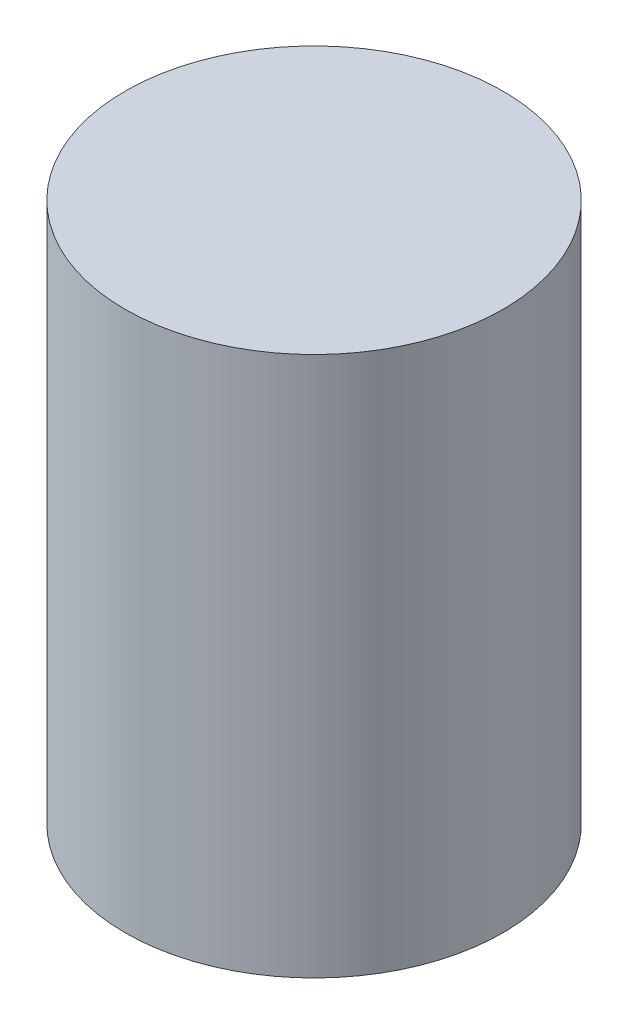
ISO-10303-21;
HEADER;
FILE_DESCRIPTION(('STEP AP214'),'2;1');
FILE_NAME('part.step','',(''),(''),'','','');
FILE_SCHEMA(('AUTOMOTIVE_DESIGN { 1 0 10303 214 1 1 1 1 }'));
ENDSEC;
DATA;
#1=APPLICATION_CONTEXT('core data for automotive mechanical design processes');
#2=APPLICATION_PROTOCOL_DEFINITION('international standard','automotive_design',2000,#1);
#3=PRODUCT_CONTEXT('',#1,'mechanical');
#4=PRODUCT('Part','Part','',(#3));
#5=PRODUCT_RELATED_PRODUCT_CATEGORY('part','',(#4));
#6=PRODUCT_DEFINITION_FORMATION('','',#4);
#7=PRODUCT_DEFINITION_CONTEXT('part definition',#1,'design');
#8=PRODUCT_DEFINITION('design','',#6,#7);
#9=PRODUCT_DEFINITION_SHAPE('','',#8);
#10=(LENGTH_UNIT() NAMED_UNIT(*) SI_UNIT(.MILLI.,.METRE.));
#11=(NAMED_UNIT(*) PLANE_ANGLE_UNIT() SI_UNIT($,.RADIAN.));
#12=(NAMED_UNIT(*) SI_UNIT($,.STERADIAN.) SOLID_ANGLE_UNIT());
#13=UNCERTAINTY_MEASURE_WITH_UNIT(LENGTH_MEASURE(1.E-05),#10,'distance_accuracy_value','');
#14=(GEOMETRIC_REPRESENTATION_CONTEXT(3) GLOBAL_UNCERTAINTY_ASSIGNED_CONTEXT((#13)) GLOBAL_UNIT_ASSIGNED_CONTEXT((#10,
#11,#12)) REPRESENTATION_CONTEXT('',''));
#15=CARTESIAN_POINT('',(0.,0.,0.));
#16=DIRECTION('',(0.,0.,1.));
#17=DIRECTION('',(1.,0.,0.));
#18=AXIS2_PLACEMENT_3D('',#15,#16,#17);
#19=CARTESIAN_POINT('',(0.,50.,0.));
#20=DIRECTION('',(0.,-1.,0.));
#21=DIRECTION('',(0.,0.,-1.));
#22=AXIS2_PLACEMENT_3D('',#19,#20,#21);
#23=CYLINDRICAL_SURFACE('',#22,17.5);
#24=CARTESIAN_POINT('',(0.,50.,0.));
#25=DIRECTION('',(0.,1.,0.));
#26=DIRECTION('',(0.,0.,1.));
#27=AXIS2_PLACEMENT_3D('',#24,#25,#26);
#28=CIRCLE('',#27,17.5);
#29=CARTESIAN_POINT('',(0.,50.,17.5));
#30=VERTEX_POINT('',#29);
#31=EDGE_CURVE('E10',#30,#30,#28,.T.);
#32=ORIENTED_EDGE('',*,*,#31,.F.);
#33=EDGE_LOOP('',(#32));
#34=FACE_BOUND('',#33,.T.);
#35=CARTESIAN_POINT('',(0.,0.,0.));
#36=DIRECTION('',(0.,1.,0.));
#37=DIRECTION('',(0.,0.,1.));
#38=AXIS2_PLACEMENT_3D('',#35,#36,#37);
#39=CIRCLE('',#38,17.5);
#40=CARTESIAN_POINT('',(0.,0.,17.5));
#41=VERTEX_POINT('',#40);
#42=EDGE_CURVE('E36',#41,#41,#39,.T.);
#43=ORIENTED_EDGE('',*,*,#42,.T.);
#44=EDGE_LOOP('',(#43));
#45=FACE_BOUND('',#44,.T.);
#46=ADVANCED_FACE('F33',(#34,#45),#23,.T.);
#47=CARTESIAN_POINT('',(0.,50.,0.));
#48=DIRECTION('',(0.,1.,0.));
#49=DIRECTION('',(0.,0.,1.));
#50=AXIS2_PLACEMENT_3D('',#47,#48,#49);
#51=PLANE('',#50);
#52=ORIENTED_EDGE('',*,*,#31,.T.);
#53=EDGE_LOOP('',(#52));
#54=FACE_BOUND('',#53,.T.);
#55=ADVANCED_FACE('F48',(#54),#51,.T.);
#56=CARTESIAN_POINT('',(0.,0.,0.));
#57=DIRECTION('',(0.,1.,0.));
#58=DIRECTION('',(0.,0.,1.));
#59=AXIS2_PLACEMENT_3D('',#56,#57,#58);
#60=PLANE('',#59);
#61=ORIENTED_EDGE('',*,*,#42,.F.);
#62=EDGE_LOOP('',(#61));
#63=FACE_BOUND('',#62,.T.);
#64=ADVANCED_FACE('F46',(#63),#60,.F.);
#65=CLOSED_SHELL('',(#46,#55,#64));
#66=MANIFOLD_SOLID_BREP('B2',#65);
#67=ADVANCED_BREP_SHAPE_REPRESENTATION('',(#18,#66),#14);
#68=SHAPE_DEFINITION_REPRESENTATION(#9,#67);
ENDSEC;
END-ISO-10303-21;
